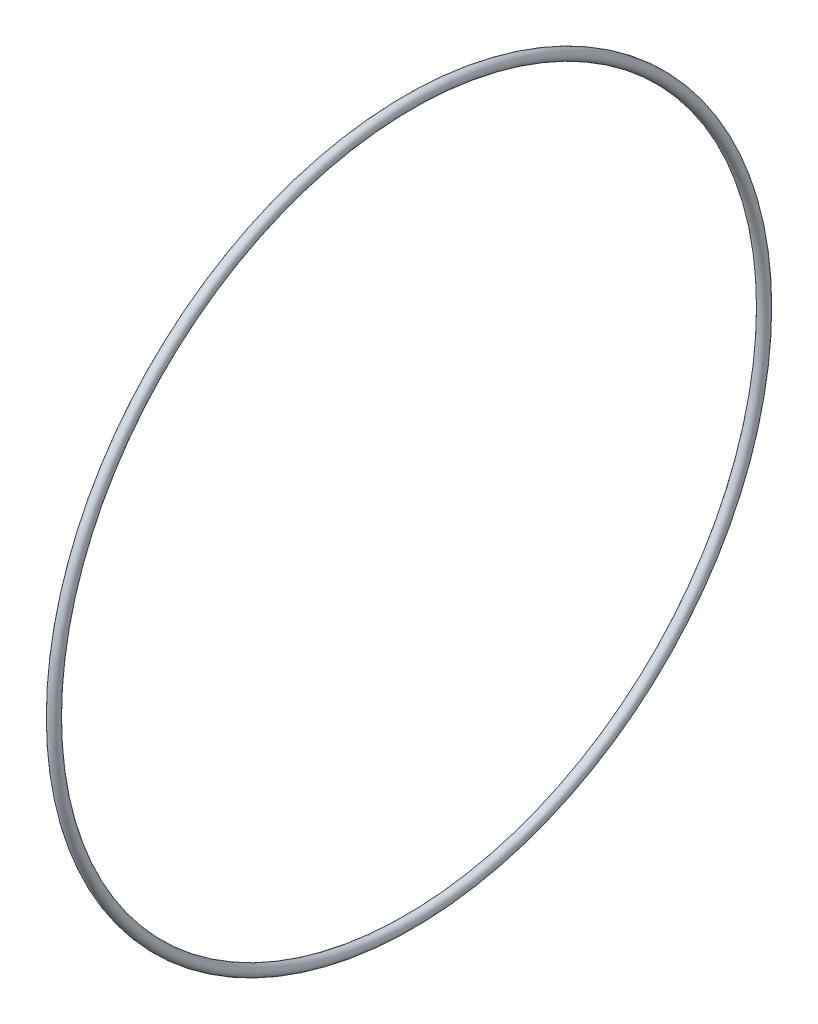
ISO-10303-21;
HEADER;
FILE_DESCRIPTION(('STEP AP214'),'2;1');
FILE_NAME('part.step','',(''),(''),'','','');
FILE_SCHEMA(('AUTOMOTIVE_DESIGN { 1 0 10303 214 1 1 1 1 }'));
ENDSEC;
DATA;
#1=APPLICATION_CONTEXT('core data for automotive mechanical design processes');
#2=APPLICATION_PROTOCOL_DEFINITION('international standard','automotive_design',2000,#1);
#3=PRODUCT_CONTEXT('',#1,'mechanical');
#4=PRODUCT('Part','Part','',(#3));
#5=PRODUCT_RELATED_PRODUCT_CATEGORY('part','',(#4));
#6=PRODUCT_DEFINITION_FORMATION('','',#4);
#7=PRODUCT_DEFINITION_CONTEXT('part definition',#1,'design');
#8=PRODUCT_DEFINITION('design','',#6,#7);
#9=PRODUCT_DEFINITION_SHAPE('','',#8);
#10=(LENGTH_UNIT() NAMED_UNIT(*) SI_UNIT(.MILLI.,.METRE.));
#11=(NAMED_UNIT(*) PLANE_ANGLE_UNIT() SI_UNIT($,.RADIAN.));
#12=(NAMED_UNIT(*) SI_UNIT($,.STERADIAN.) SOLID_ANGLE_UNIT());
#13=UNCERTAINTY_MEASURE_WITH_UNIT(LENGTH_MEASURE(1.E-05),#10,'distance_accuracy_value','');
#14=(GEOMETRIC_REPRESENTATION_CONTEXT(3) GLOBAL_UNCERTAINTY_ASSIGNED_CONTEXT((#13)) GLOBAL_UNIT_ASSIGNED_CONTEXT((#10,
#11,#12)) REPRESENTATION_CONTEXT('',''));
#15=CARTESIAN_POINT('',(0.,0.,0.));
#16=DIRECTION('',(0.,0.,1.));
#17=DIRECTION('',(1.,0.,0.));
#18=AXIS2_PLACEMENT_3D('',#15,#16,#17);
#19=CARTESIAN_POINT('',(0.,0.,0.));
#20=DIRECTION('',(-1.,0.,0.));
#21=DIRECTION('',(0.,0.,1.));
#22=AXIS2_PLACEMENT_3D('',#19,#20,#21);
#23=TOROIDAL_SURFACE('',#22,110.,1.6666666666665);
#24=CARTESIAN_POINT('',(0.,0.,111.666666666667));
#25=VERTEX_POINT('',#24);
#26=VERTEX_LOOP('',#25);
#27=FACE_BOUND('',#26,.T.);
#28=ADVANCED_FACE('F39',(#27),#23,.T.);
#29=CLOSED_SHELL('',(#28));
#30=MANIFOLD_SOLID_BREP('B2',#29);
#31=ADVANCED_BREP_SHAPE_REPRESENTATION('',(#18,#30),#14);
#32=SHAPE_DEFINITION_REPRESENTATION(#9,#31);
ENDSEC;
END-ISO-10303-21;
